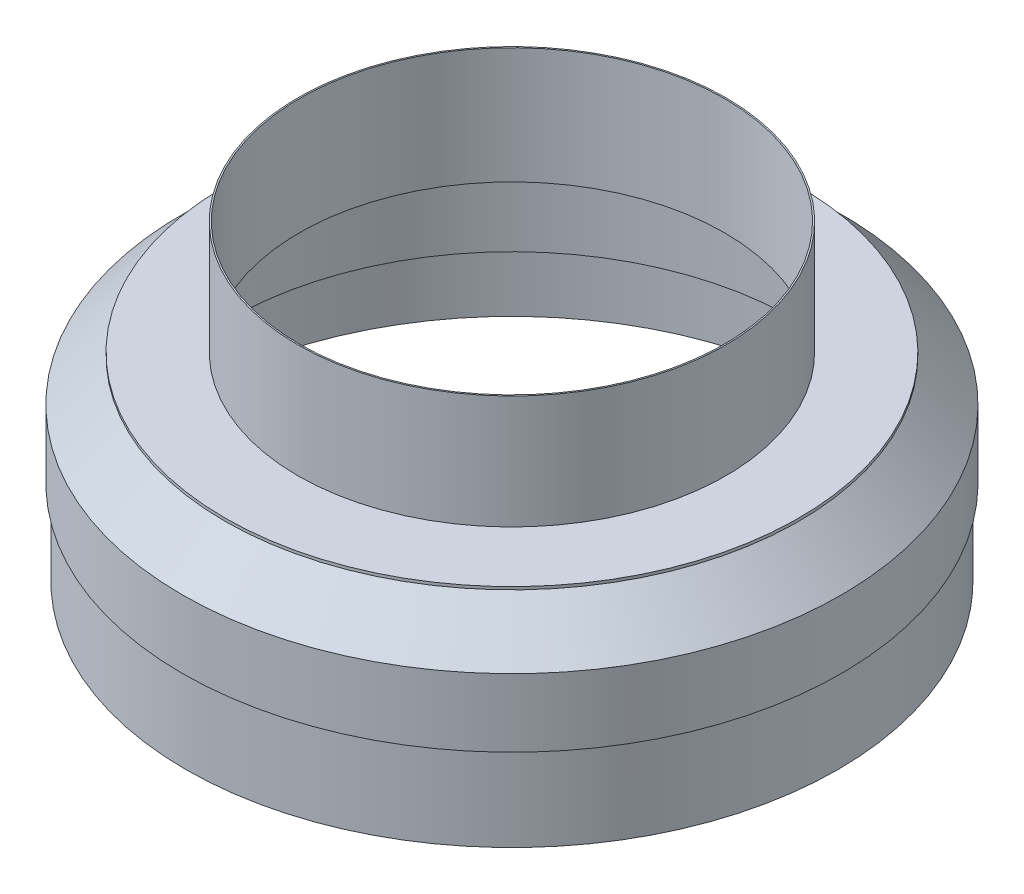
ISO-10303-21;
HEADER;
FILE_DESCRIPTION(('STEP AP214'),'2;1');
FILE_NAME('part.step','',(''),(''),'','','');
FILE_SCHEMA(('AUTOMOTIVE_DESIGN { 1 0 10303 214 1 1 1 1 }'));
ENDSEC;
DATA;
#1=APPLICATION_CONTEXT('core data for automotive mechanical design processes');
#2=APPLICATION_PROTOCOL_DEFINITION('international standard','automotive_design',2000,#1);
#3=PRODUCT_CONTEXT('',#1,'mechanical');
#4=PRODUCT('Part','Part','',(#3));
#5=PRODUCT_RELATED_PRODUCT_CATEGORY('part','',(#4));
#6=PRODUCT_DEFINITION_FORMATION('','',#4);
#7=PRODUCT_DEFINITION_CONTEXT('part definition',#1,'design');
#8=PRODUCT_DEFINITION('design','',#6,#7);
#9=PRODUCT_DEFINITION_SHAPE('','',#8);
#10=(LENGTH_UNIT() NAMED_UNIT(*) SI_UNIT(.MILLI.,.METRE.));
#11=(NAMED_UNIT(*) PLANE_ANGLE_UNIT() SI_UNIT($,.RADIAN.));
#12=(NAMED_UNIT(*) SI_UNIT($,.STERADIAN.) SOLID_ANGLE_UNIT());
#13=UNCERTAINTY_MEASURE_WITH_UNIT(LENGTH_MEASURE(1.E-05),#10,'distance_accuracy_value','');
#14=(GEOMETRIC_REPRESENTATION_CONTEXT(3) GLOBAL_UNCERTAINTY_ASSIGNED_CONTEXT((#13)) GLOBAL_UNIT_ASSIGNED_CONTEXT((#10,
#11,#12)) REPRESENTATION_CONTEXT('',''));
#15=CARTESIAN_POINT('',(0.,0.,0.));
#16=DIRECTION('',(0.,0.,1.));
#17=DIRECTION('',(1.,0.,0.));
#18=AXIS2_PLACEMENT_3D('',#15,#16,#17);
#19=CARTESIAN_POINT('',(0.,0.,0.));
#20=DIRECTION('',(0.,1.,0.));
#21=DIRECTION('',(0.,0.,1.));
#22=AXIS2_PLACEMENT_3D('',#19,#20,#21);
#23=PLANE('',#22);
#24=CARTESIAN_POINT('',(0.,0.,0.));
#25=DIRECTION('',(0.,1.,0.));
#26=DIRECTION('',(0.,0.,1.));
#27=AXIS2_PLACEMENT_3D('',#24,#25,#26);
#28=CIRCLE('',#27,232.5);
#29=CARTESIAN_POINT('',(0.,0.,232.5));
#30=VERTEX_POINT('',#29);
#31=EDGE_CURVE('E62',#30,#30,#28,.T.);
#32=ORIENTED_EDGE('',*,*,#31,.F.);
#33=EDGE_LOOP('',(#32));
#34=FACE_BOUND('',#33,.T.);
#35=CARTESIAN_POINT('',(0.,0.,0.));
#36=DIRECTION('',(0.,1.,0.));
#37=DIRECTION('',(0.,0.,1.));
#38=AXIS2_PLACEMENT_3D('',#35,#36,#37);
#39=CIRCLE('',#38,230.);
#40=CARTESIAN_POINT('',(0.,0.,230.));
#41=VERTEX_POINT('',#40);
#42=EDGE_CURVE('E10',#41,#41,#39,.F.);
#43=ORIENTED_EDGE('',*,*,#42,.F.);
#44=EDGE_LOOP('',(#43));
#45=FACE_BOUND('',#44,.T.);
#46=ADVANCED_FACE('F30',(#34,#45),#23,.F.);
#47=CARTESIAN_POINT('',(0.,160.,0.));
#48=DIRECTION('',(0.,1.,0.));
#49=DIRECTION('',(0.,0.,1.));
#50=AXIS2_PLACEMENT_3D('',#47,#48,#49);
#51=PLANE('',#50);
#52=CARTESIAN_POINT('',(0.,160.,0.));
#53=DIRECTION('',(0.,1.,0.));
#54=DIRECTION('',(0.,0.,1.));
#55=AXIS2_PLACEMENT_3D('',#52,#53,#54);
#56=CIRCLE('',#55,151.);
#57=CARTESIAN_POINT('',(0.,160.,151.));
#58=VERTEX_POINT('',#57);
#59=EDGE_CURVE('E37',#58,#58,#56,.T.);
#60=ORIENTED_EDGE('',*,*,#59,.T.);
#61=EDGE_LOOP('',(#60));
#62=FACE_BOUND('',#61,.T.);
#63=CARTESIAN_POINT('',(0.,160.,0.));
#64=DIRECTION('',(0.,1.,0.));
#65=DIRECTION('',(0.,0.,1.));
#66=AXIS2_PLACEMENT_3D('',#63,#64,#65);
#67=CIRCLE('',#66,150.);
#68=CARTESIAN_POINT('',(0.,160.,150.));
#69=VERTEX_POINT('',#68);
#70=EDGE_CURVE('E41',#69,#69,#67,.T.);
#71=ORIENTED_EDGE('',*,*,#70,.F.);
#72=EDGE_LOOP('',(#71));
#73=FACE_BOUND('',#72,.T.);
#74=ADVANCED_FACE('F101',(#62,#73),#51,.T.);
#75=CARTESIAN_POINT('',(0.,78.,0.));
#76=DIRECTION('',(0.,1.,0.));
#77=DIRECTION('',(0.,0.,1.));
#78=AXIS2_PLACEMENT_3D('',#75,#76,#77);
#79=PLANE('',#78);
#80=CARTESIAN_POINT('',(0.,78.,0.));
#81=DIRECTION('',(0.,1.,0.));
#82=DIRECTION('',(0.,0.,1.));
#83=AXIS2_PLACEMENT_3D('',#80,#81,#82);
#84=CIRCLE('',#83,200.);
#85=CARTESIAN_POINT('',(0.,78.,200.));
#86=VERTEX_POINT('',#85);
#87=EDGE_CURVE('E65',#86,#86,#84,.T.);
#88=ORIENTED_EDGE('',*,*,#87,.F.);
#89=EDGE_LOOP('',(#88));
#90=FACE_BOUND('',#89,.T.);
#91=CARTESIAN_POINT('',(0.,78.,0.));
#92=DIRECTION('',(0.,1.,0.));
#93=DIRECTION('',(0.,0.,1.));
#94=AXIS2_PLACEMENT_3D('',#91,#92,#93);
#95=CIRCLE('',#94,150.);
#96=CARTESIAN_POINT('',(0.,78.,150.));
#97=VERTEX_POINT('',#96);
#98=EDGE_CURVE('E45',#97,#97,#95,.T.);
#99=ORIENTED_EDGE('',*,*,#98,.T.);
#100=EDGE_LOOP('',(#99));
#101=FACE_BOUND('',#100,.T.);
#102=ADVANCED_FACE('F108',(#90,#101),#79,.F.);
#103=CARTESIAN_POINT('',(0.,160.,0.));
#104=DIRECTION('',(0.,-1.,0.));
#105=DIRECTION('',(0.,0.,-1.));
#106=AXIS2_PLACEMENT_3D('',#103,#104,#105);
#107=CYLINDRICAL_SURFACE('',#106,151.);
#108=CARTESIAN_POINT('',(0.,80.,0.));
#109=DIRECTION('',(0.,1.,0.));
#110=DIRECTION('',(0.,0.,1.));
#111=AXIS2_PLACEMENT_3D('',#108,#109,#110);
#112=CIRCLE('',#111,151.);
#113=CARTESIAN_POINT('',(0.,80.,151.));
#114=VERTEX_POINT('',#113);
#115=EDGE_CURVE('E49',#114,#114,#112,.T.);
#116=ORIENTED_EDGE('',*,*,#115,.T.);
#117=EDGE_LOOP('',(#116));
#118=FACE_BOUND('',#117,.T.);
#119=ORIENTED_EDGE('',*,*,#59,.F.);
#120=EDGE_LOOP('',(#119));
#121=FACE_BOUND('',#120,.T.);
#122=ADVANCED_FACE('F32',(#118,#121),#107,.T.);
#123=CARTESIAN_POINT('',(0.,160.,0.));
#124=DIRECTION('',(0.,-1.,0.));
#125=DIRECTION('',(0.,0.,-1.));
#126=AXIS2_PLACEMENT_3D('',#123,#124,#125);
#127=CYLINDRICAL_SURFACE('',#126,150.);
#128=ORIENTED_EDGE('',*,*,#70,.T.);
#129=EDGE_LOOP('',(#128));
#130=FACE_BOUND('',#129,.T.);
#131=ORIENTED_EDGE('',*,*,#98,.F.);
#132=EDGE_LOOP('',(#131));
#133=FACE_BOUND('',#132,.T.);
#134=ADVANCED_FACE('F140',(#130,#133),#127,.F.);
#135=CARTESIAN_POINT('',(0.,80.,0.));
#136=DIRECTION('',(0.,1.,0.));
#137=DIRECTION('',(0.,0.,1.));
#138=AXIS2_PLACEMENT_3D('',#135,#136,#137);
#139=PLANE('',#138);
#140=CARTESIAN_POINT('',(0.,80.,0.));
#141=DIRECTION('',(0.,1.,0.));
#142=DIRECTION('',(0.,0.,1.));
#143=AXIS2_PLACEMENT_3D('',#140,#141,#142);
#144=CIRCLE('',#143,202.5);
#145=CARTESIAN_POINT('',(0.,80.,202.5));
#146=VERTEX_POINT('',#145);
#147=EDGE_CURVE('E53',#146,#146,#144,.T.);
#148=ORIENTED_EDGE('',*,*,#147,.T.);
#149=EDGE_LOOP('',(#148));
#150=FACE_BOUND('',#149,.T.);
#151=ORIENTED_EDGE('',*,*,#115,.F.);
#152=EDGE_LOOP('',(#151));
#153=FACE_BOUND('',#152,.T.);
#154=ADVANCED_FACE('F123',(#150,#153),#139,.T.);
#155=CARTESIAN_POINT('',(0.,80.,0.));
#156=DIRECTION('',(0.,-1.,0.));
#157=DIRECTION('',(0.,0.,-1.));
#158=AXIS2_PLACEMENT_3D('',#155,#156,#157);
#159=CYLINDRICAL_SURFACE('',#158,202.5);
#160=ORIENTED_EDGE('',*,*,#147,.F.);
#161=EDGE_LOOP('',(#160));
#162=FACE_BOUND('',#161,.T.);
#163=CARTESIAN_POINT('',(0.,78.,0.));
#164=DIRECTION('',(0.,1.,0.));
#165=DIRECTION('',(0.,0.,1.));
#166=AXIS2_PLACEMENT_3D('',#163,#164,#165);
#167=CIRCLE('',#166,202.5);
#168=CARTESIAN_POINT('',(0.,78.,202.5));
#169=VERTEX_POINT('',#168);
#170=EDGE_CURVE('E59',#169,#169,#167,.T.);
#171=ORIENTED_EDGE('',*,*,#170,.T.);
#172=EDGE_LOOP('',(#171));
#173=FACE_BOUND('',#172,.T.);
#174=ADVANCED_FACE('F116',(#162,#173),#159,.T.);
#175=CARTESIAN_POINT('',(0.,0.,0.));
#176=DIRECTION('',(0.,-1.,0.));
#177=DIRECTION('',(0.,0.,-1.));
#178=AXIS2_PLACEMENT_3D('',#175,#176,#177);
#179=CIRCLE('',#178,229.);
#180=CARTESIAN_POINT('',(0.,0.,-229.));
#181=VERTEX_POINT('',#180);
#182=EDGE_CURVE('E75',#181,#181,#179,.T.);
#183=ORIENTED_EDGE('',*,*,#182,.T.);
#184=EDGE_LOOP('',(#183));
#185=FACE_BOUND('',#184,.T.);
#186=CARTESIAN_POINT('',(0.,0.,0.));
#187=DIRECTION('',(0.,1.,0.));
#188=DIRECTION('',(0.,0.,1.));
#189=AXIS2_PLACEMENT_3D('',#186,#187,#188);
#190=CIRCLE('',#189,200.);
#191=CARTESIAN_POINT('',(0.,0.,200.));
#192=VERTEX_POINT('',#191);
#193=EDGE_CURVE('E66',#192,#192,#190,.T.);
#194=ORIENTED_EDGE('',*,*,#193,.T.);
#195=EDGE_LOOP('',(#194));
#196=FACE_BOUND('',#195,.T.);
#197=ADVANCED_FACE('F104',(#185,#196),#23,.F.);
#198=CARTESIAN_POINT('',(0.,78.,0.));
#199=DIRECTION('',(0.,-1.,0.));
#200=DIRECTION('',(0.,0.,-1.));
#201=AXIS2_PLACEMENT_3D('',#198,#199,#200);
#202=CYLINDRICAL_SURFACE('',#201,232.5);
#203=CARTESIAN_POINT('',(0.,47.9999999999998,0.));
#204=DIRECTION('',(0.,1.,0.));
#205=DIRECTION('',(0.,0.,1.));
#206=AXIS2_PLACEMENT_3D('',#203,#204,#205);
#207=CIRCLE('',#206,232.5);
#208=CARTESIAN_POINT('',(0.,47.9999999999998,232.5));
#209=VERTEX_POINT('',#208);
#210=EDGE_CURVE('E56',#209,#209,#207,.F.);
#211=ORIENTED_EDGE('',*,*,#210,.T.);
#212=EDGE_LOOP('',(#211));
#213=FACE_BOUND('',#212,.T.);
#214=ORIENTED_EDGE('',*,*,#31,.T.);
#215=EDGE_LOOP('',(#214));
#216=FACE_BOUND('',#215,.T.);
#217=ADVANCED_FACE('F115',(#213,#216),#202,.T.);
#218=CARTESIAN_POINT('',(0.,78.,0.));
#219=DIRECTION('',(0.,-1.,0.));
#220=DIRECTION('',(0.,0.,-1.));
#221=AXIS2_PLACEMENT_3D('',#218,#219,#220);
#222=CYLINDRICAL_SURFACE('',#221,200.);
#223=ORIENTED_EDGE('',*,*,#87,.T.);
#224=EDGE_LOOP('',(#223));
#225=FACE_BOUND('',#224,.T.);
#226=ORIENTED_EDGE('',*,*,#193,.F.);
#227=EDGE_LOOP('',(#226));
#228=FACE_BOUND('',#227,.T.);
#229=ADVANCED_FACE('F96',(#225,#228),#222,.F.);
#230=CARTESIAN_POINT('',(0.,78.,0.));
#231=DIRECTION('',(0.,-1.,0.));
#232=DIRECTION('',(0.,0.,-1.));
#233=AXIS2_PLACEMENT_3D('',#230,#231,#232);
#234=CONICAL_SURFACE('',#233,202.5,0.785398163397444);
#235=ORIENTED_EDGE('',*,*,#210,.F.);
#236=EDGE_LOOP('',(#235));
#237=FACE_BOUND('',#236,.T.);
#238=ORIENTED_EDGE('',*,*,#170,.F.);
#239=EDGE_LOOP('',(#238));
#240=FACE_BOUND('',#239,.T.);
#241=ADVANCED_FACE('F87',(#237,#240),#234,.T.);
#242=CARTESIAN_POINT('',(0.,-60.,0.));
#243=DIRECTION('',(0.,-1.,0.));
#244=DIRECTION('',(0.,0.,-1.));
#245=AXIS2_PLACEMENT_3D('',#242,#243,#244);
#246=PLANE('',#245);
#247=CARTESIAN_POINT('',(0.,-60.,0.));
#248=DIRECTION('',(0.,-1.,0.));
#249=DIRECTION('',(0.,0.,-1.));
#250=AXIS2_PLACEMENT_3D('',#247,#248,#249);
#251=CIRCLE('',#250,230.);
#252=CARTESIAN_POINT('',(0.,-60.,-230.));
#253=VERTEX_POINT('',#252);
#254=EDGE_CURVE('E69',#253,#253,#251,.T.);
#255=ORIENTED_EDGE('',*,*,#254,.T.);
#256=EDGE_LOOP('',(#255));
#257=FACE_BOUND('',#256,.T.);
#258=CARTESIAN_POINT('',(0.,-60.,0.));
#259=DIRECTION('',(0.,-1.,0.));
#260=DIRECTION('',(0.,0.,-1.));
#261=AXIS2_PLACEMENT_3D('',#258,#259,#260);
#262=CIRCLE('',#261,229.);
#263=CARTESIAN_POINT('',(0.,-60.,-229.));
#264=VERTEX_POINT('',#263);
#265=EDGE_CURVE('E74',#264,#264,#262,.T.);
#266=ORIENTED_EDGE('',*,*,#265,.F.);
#267=EDGE_LOOP('',(#266));
#268=FACE_BOUND('',#267,.T.);
#269=ADVANCED_FACE('F84',(#257,#268),#246,.T.);
#270=CARTESIAN_POINT('',(0.,-60.,0.));
#271=DIRECTION('',(0.,1.,0.));
#272=DIRECTION('',(0.,0.,1.));
#273=AXIS2_PLACEMENT_3D('',#270,#271,#272);
#274=CYLINDRICAL_SURFACE('',#273,230.);
#275=ORIENTED_EDGE('',*,*,#254,.F.);
#276=EDGE_LOOP('',(#275));
#277=FACE_BOUND('',#276,.T.);
#278=ORIENTED_EDGE('',*,*,#42,.T.);
#279=EDGE_LOOP('',(#278));
#280=FACE_BOUND('',#279,.T.);
#281=ADVANCED_FACE('F86',(#277,#280),#274,.T.);
#282=CARTESIAN_POINT('',(0.,-60.,0.));
#283=DIRECTION('',(0.,1.,0.));
#284=DIRECTION('',(0.,0.,1.));
#285=AXIS2_PLACEMENT_3D('',#282,#283,#284);
#286=CYLINDRICAL_SURFACE('',#285,229.);
#287=ORIENTED_EDGE('',*,*,#265,.T.);
#288=EDGE_LOOP('',(#287));
#289=FACE_BOUND('',#288,.T.);
#290=ORIENTED_EDGE('',*,*,#182,.F.);
#291=EDGE_LOOP('',(#290));
#292=FACE_BOUND('',#291,.T.);
#293=ADVANCED_FACE('F81',(#289,#292),#286,.F.);
#294=CLOSED_SHELL('',(#46,#74,#102,#122,#134,#154,#174,#197,#217,#229,#241,#269,#281,#293));
#295=MANIFOLD_SOLID_BREP('B2',#294);
#296=ADVANCED_BREP_SHAPE_REPRESENTATION('',(#18,#295),#14);
#297=SHAPE_DEFINITION_REPRESENTATION(#9,#296);
ENDSEC;
END-ISO-10303-21;
